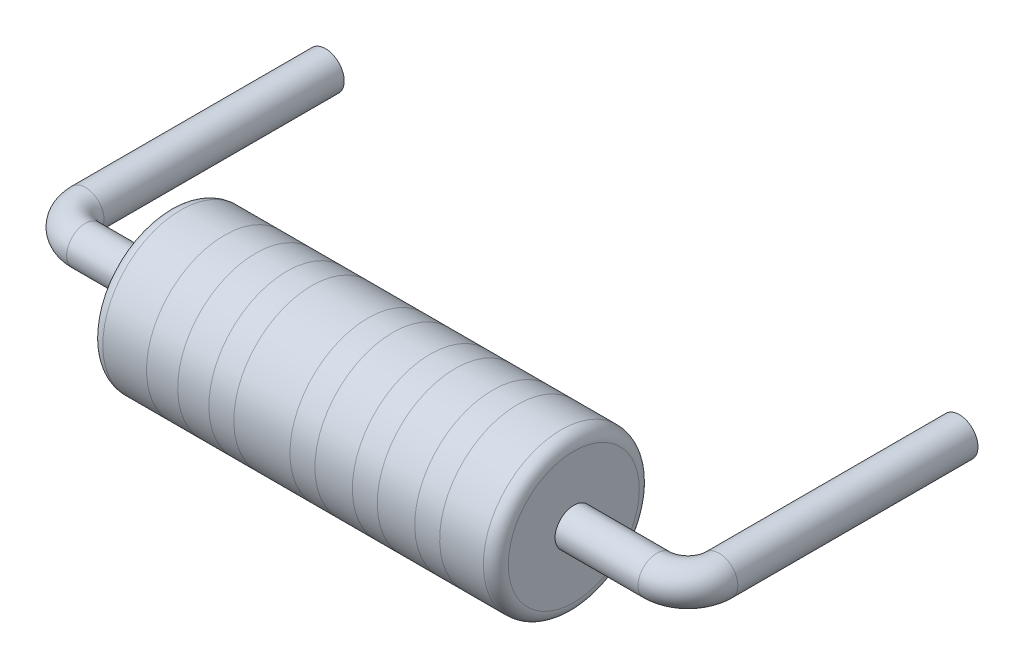
ISO-10303-21;
HEADER;
FILE_DESCRIPTION(('STEP AP214'),'2;1');
FILE_NAME('part.step','',(''),(''),'','','');
FILE_SCHEMA(('AUTOMOTIVE_DESIGN { 1 0 10303 214 1 1 1 1 }'));
ENDSEC;
DATA;
#1=APPLICATION_CONTEXT('core data for automotive mechanical design processes');
#2=APPLICATION_PROTOCOL_DEFINITION('international standard','automotive_design',2000,#1);
#3=PRODUCT_CONTEXT('',#1,'mechanical');
#4=PRODUCT('Part','Part','',(#3));
#5=PRODUCT_RELATED_PRODUCT_CATEGORY('part','',(#4));
#6=PRODUCT_DEFINITION_FORMATION('','',#4);
#7=PRODUCT_DEFINITION_CONTEXT('part definition',#1,'design');
#8=PRODUCT_DEFINITION('design','',#6,#7);
#9=PRODUCT_DEFINITION_SHAPE('','',#8);
#10=(LENGTH_UNIT() NAMED_UNIT(*) SI_UNIT(.MILLI.,.METRE.));
#11=(NAMED_UNIT(*) PLANE_ANGLE_UNIT() SI_UNIT($,.RADIAN.));
#12=(NAMED_UNIT(*) SI_UNIT($,.STERADIAN.) SOLID_ANGLE_UNIT());
#13=UNCERTAINTY_MEASURE_WITH_UNIT(LENGTH_MEASURE(1.E-05),#10,'distance_accuracy_value','');
#14=(GEOMETRIC_REPRESENTATION_CONTEXT(3) GLOBAL_UNCERTAINTY_ASSIGNED_CONTEXT((#13)) GLOBAL_UNIT_ASSIGNED_CONTEXT((#10,
#11,#12)) REPRESENTATION_CONTEXT('',''));
#15=CARTESIAN_POINT('',(0.,0.,0.));
#16=DIRECTION('',(0.,0.,1.));
#17=DIRECTION('',(1.,0.,0.));
#18=AXIS2_PLACEMENT_3D('',#15,#16,#17);
#19=CARTESIAN_POINT('',(1.35,-1.386,2.636));
#20=DIRECTION('',(1.,0.,0.));
#21=DIRECTION('',(0.,0.,-1.));
#22=AXIS2_PLACEMENT_3D('',#19,#20,#21);
#23=PLANE('',#22);
#24=CARTESIAN_POINT('',(1.35,0.,1.25));
#25=DIRECTION('',(1.,0.,0.));
#26=DIRECTION('',(0.,1.,0.));
#27=AXIS2_PLACEMENT_3D('',#24,#25,#26);
#28=CIRCLE('',#27,1.25);
#29=CARTESIAN_POINT('',(1.35,1.25,1.25));
#30=VERTEX_POINT('',#29);
#31=EDGE_CURVE('P0_E25',#30,#30,#28,.T.);
#32=ORIENTED_EDGE('',*,*,#31,.F.);
#33=EDGE_LOOP('',(#32));
#34=FACE_BOUND('',#33,.T.);
#35=ADVANCED_FACE('P0_F22',(#34),#23,.F.);
#36=CARTESIAN_POINT('',(0.,0.,1.25));
#37=DIRECTION('',(1.,0.,0.));
#38=DIRECTION('',(0.,1.,0.));
#39=AXIS2_PLACEMENT_3D('',#36,#37,#38);
#40=CYLINDRICAL_SURFACE('',#39,1.25);
#41=CARTESIAN_POINT('',(1.95,0.,1.25));
#42=DIRECTION('',(1.,0.,0.));
#43=DIRECTION('',(0.,1.,0.));
#44=AXIS2_PLACEMENT_3D('',#41,#42,#43);
#45=CIRCLE('',#44,1.25);
#46=CARTESIAN_POINT('',(1.95,1.25,1.25));
#47=VERTEX_POINT('',#46);
#48=EDGE_CURVE('P0_E12',#47,#47,#45,.T.);
#49=ORIENTED_EDGE('',*,*,#48,.F.);
#50=EDGE_LOOP('',(#49));
#51=FACE_BOUND('',#50,.T.);
#52=ORIENTED_EDGE('',*,*,#31,.T.);
#53=EDGE_LOOP('',(#52));
#54=FACE_BOUND('',#53,.T.);
#55=ADVANCED_FACE('P0_F34',(#51,#54),#40,.T.);
#56=CARTESIAN_POINT('',(1.95,-1.386,2.636));
#57=DIRECTION('',(1.,0.,0.));
#58=DIRECTION('',(0.,0.,-1.));
#59=AXIS2_PLACEMENT_3D('',#56,#57,#58);
#60=PLANE('',#59);
#61=ORIENTED_EDGE('',*,*,#48,.T.);
#62=EDGE_LOOP('',(#61));
#63=FACE_BOUND('',#62,.T.);
#64=ADVANCED_FACE('P0_F41',(#63),#60,.T.);
#65=CLOSED_SHELL('',(#35,#55,#64));
#66=MANIFOLD_SOLID_BREP('P0_B1',#65);
#67=CARTESIAN_POINT('',(3.25,0.,1.25));
#68=DIRECTION('',(1.,0.,0.));
#69=DIRECTION('',(0.,0.,-1.));
#70=AXIS2_PLACEMENT_3D('',#67,#68,#69);
#71=PLANE('',#70);
#72=CARTESIAN_POINT('',(3.25,0.,1.25));
#73=DIRECTION('',(-1.,0.,0.));
#74=DIRECTION('',(0.,0.,1.));
#75=AXIS2_PLACEMENT_3D('',#72,#73,#74);
#76=CIRCLE('',#75,1.05);
#77=CARTESIAN_POINT('',(3.25,0.,2.3));
#78=VERTEX_POINT('',#77);
#79=CARTESIAN_POINT('',(3.25,1.05,1.25));
#80=VERTEX_POINT('',#79);
#81=EDGE_CURVE('P1_E49',#78,#80,#76,.T.);
#82=ORIENTED_EDGE('',*,*,#81,.F.);
#83=CARTESIAN_POINT('',(3.25,0.,1.25));
#84=DIRECTION('',(-1.,0.,0.));
#85=DIRECTION('',(0.,0.,-1.));
#86=AXIS2_PLACEMENT_3D('',#83,#84,#85);
#87=CIRCLE('',#86,1.05);
#88=CARTESIAN_POINT('',(3.25,0.,0.2));
#89=VERTEX_POINT('',#88);
#90=EDGE_CURVE('P1_E42',#89,#78,#87,.T.);
#91=ORIENTED_EDGE('',*,*,#90,.F.);
#92=CARTESIAN_POINT('',(3.25,0.,1.25));
#93=DIRECTION('',(-1.,0.,0.));
#94=DIRECTION('',(0.,1.,0.));
#95=AXIS2_PLACEMENT_3D('',#92,#93,#94);
#96=CIRCLE('',#95,1.05);
#97=EDGE_CURVE('P1_E48',#80,#89,#96,.T.);
#98=ORIENTED_EDGE('',*,*,#97,.F.);
#99=EDGE_LOOP('',(#82,#91,#98));
#100=FACE_BOUND('',#99,.T.);
#101=ADVANCED_FACE('P1_F24',(#100),#71,.T.);
#102=CARTESIAN_POINT('',(3.05,0.,1.25));
#103=DIRECTION('',(1.,0.,0.));
#104=DIRECTION('',(0.,0.,-1.));
#105=AXIS2_PLACEMENT_3D('',#102,#103,#104);
#106=TOROIDAL_SURFACE('',#105,1.05,0.2);
#107=ORIENTED_EDGE('',*,*,#97,.T.);
#108=ORIENTED_EDGE('',*,*,#90,.T.);
#109=ORIENTED_EDGE('',*,*,#81,.T.);
#110=EDGE_LOOP('',(#107,#108,#109));
#111=FACE_BOUND('',#110,.T.);
#112=CARTESIAN_POINT('',(3.05,0.,1.25));
#113=DIRECTION('',(1.,0.,0.));
#114=DIRECTION('',(0.,1.,0.));
#115=AXIS2_PLACEMENT_3D('',#112,#113,#114);
#116=CIRCLE('',#115,1.25);
#117=CARTESIAN_POINT('',(3.05,1.25,1.25));
#118=VERTEX_POINT('',#117);
#119=EDGE_CURVE('P1_E34',#118,#118,#116,.F.);
#120=ORIENTED_EDGE('',*,*,#119,.F.);
#121=EDGE_LOOP('',(#120));
#122=FACE_BOUND('',#121,.T.);
#123=ADVANCED_FACE('P1_F51',(#111,#122),#106,.T.);
#124=CARTESIAN_POINT('',(0.,0.,1.25));
#125=DIRECTION('',(1.,0.,0.));
#126=DIRECTION('',(0.,1.,0.));
#127=AXIS2_PLACEMENT_3D('',#124,#125,#126);
#128=CYLINDRICAL_SURFACE('',#127,1.25);
#129=ORIENTED_EDGE('',*,*,#119,.T.);
#130=EDGE_LOOP('',(#129));
#131=FACE_BOUND('',#130,.T.);
#132=CARTESIAN_POINT('',(2.35,0.,1.25));
#133=DIRECTION('',(1.,0.,0.));
#134=DIRECTION('',(0.,1.,0.));
#135=AXIS2_PLACEMENT_3D('',#132,#133,#134);
#136=CIRCLE('',#135,1.25);
#137=CARTESIAN_POINT('',(2.35,1.25,1.25));
#138=VERTEX_POINT('',#137);
#139=EDGE_CURVE('P1_E13',#138,#138,#136,.T.);
#140=ORIENTED_EDGE('',*,*,#139,.T.);
#141=EDGE_LOOP('',(#140));
#142=FACE_BOUND('',#141,.T.);
#143=ADVANCED_FACE('P1_F96',(#131,#142),#128,.T.);
#144=CARTESIAN_POINT('',(2.35,-1.386,2.636));
#145=DIRECTION('',(1.,0.,0.));
#146=DIRECTION('',(0.,0.,-1.));
#147=AXIS2_PLACEMENT_3D('',#144,#145,#146);
#148=PLANE('',#147);
#149=ORIENTED_EDGE('',*,*,#139,.F.);
#150=EDGE_LOOP('',(#149));
#151=FACE_BOUND('',#150,.T.);
#152=ADVANCED_FACE('P1_F108',(#151),#148,.F.);
#153=CLOSED_SHELL('',(#101,#123,#143,#152));
#154=MANIFOLD_SOLID_BREP('P1_B1',#153);
#155=CARTESIAN_POINT('',(-0.05,0.,1.25));
#156=DIRECTION('',(-1.,0.,0.));
#157=DIRECTION('',(0.,0.,1.));
#158=AXIS2_PLACEMENT_3D('',#155,#156,#157);
#159=PLANE('',#158);
#160=CARTESIAN_POINT('',(-0.0499999999999997,0.,1.25));
#161=DIRECTION('',(1.,0.,0.));
#162=DIRECTION('',(0.,1.,0.));
#163=AXIS2_PLACEMENT_3D('',#160,#161,#162);
#164=CIRCLE('',#163,1.25);
#165=CARTESIAN_POINT('',(-0.0499999999999995,1.25,1.25));
#166=VERTEX_POINT('',#165);
#167=EDGE_CURVE('P2_E17',#166,#166,#164,.T.);
#168=ORIENTED_EDGE('',*,*,#167,.F.);
#169=EDGE_LOOP('',(#168));
#170=FACE_BOUND('',#169,.T.);
#171=ADVANCED_FACE('P2_F14',(#170),#159,.T.);
#172=CARTESIAN_POINT('',(0.1,0.,1.25));
#173=DIRECTION('',(1.,0.,0.));
#174=DIRECTION('',(0.,1.,0.));
#175=AXIS2_PLACEMENT_3D('',#172,#173,#174);
#176=CYLINDRICAL_SURFACE('',#175,1.25);
#177=CARTESIAN_POINT('',(0.35,0.,1.25));
#178=DIRECTION('',(1.,0.,0.));
#179=DIRECTION('',(0.,1.,0.));
#180=AXIS2_PLACEMENT_3D('',#177,#178,#179);
#181=CIRCLE('',#180,1.25);
#182=CARTESIAN_POINT('',(0.350000000000001,1.25,1.25));
#183=VERTEX_POINT('',#182);
#184=EDGE_CURVE('P2_E10',#183,#183,#181,.T.);
#185=ORIENTED_EDGE('',*,*,#184,.F.);
#186=EDGE_LOOP('',(#185));
#187=FACE_BOUND('',#186,.T.);
#188=ORIENTED_EDGE('',*,*,#167,.T.);
#189=EDGE_LOOP('',(#188));
#190=FACE_BOUND('',#189,.T.);
#191=ADVANCED_FACE('P2_F26',(#187,#190),#176,.T.);
#192=CARTESIAN_POINT('',(0.35,0.,1.25));
#193=DIRECTION('',(1.,0.,0.));
#194=DIRECTION('',(0.,0.,-1.));
#195=AXIS2_PLACEMENT_3D('',#192,#193,#194);
#196=PLANE('',#195);
#197=ORIENTED_EDGE('',*,*,#184,.T.);
#198=EDGE_LOOP('',(#197));
#199=FACE_BOUND('',#198,.T.);
#200=ADVANCED_FACE('P2_F33',(#199),#196,.T.);
#201=CLOSED_SHELL('',(#171,#191,#200));
#202=MANIFOLD_SOLID_BREP('P2_B1',#201);
#203=CARTESIAN_POINT('',(1.35,0.,1.25));
#204=DIRECTION('',(1.,0.,0.));
#205=DIRECTION('',(0.,0.,-1.));
#206=AXIS2_PLACEMENT_3D('',#203,#204,#205);
#207=PLANE('',#206);
#208=CARTESIAN_POINT('',(1.35,0.,1.25));
#209=DIRECTION('',(1.,0.,0.));
#210=DIRECTION('',(0.,1.,0.));
#211=AXIS2_PLACEMENT_3D('',#208,#209,#210);
#212=CIRCLE('',#211,1.25);
#213=CARTESIAN_POINT('',(1.35,1.25,1.25));
#214=VERTEX_POINT('',#213);
#215=EDGE_CURVE('P3_E17',#214,#214,#212,.F.);
#216=ORIENTED_EDGE('',*,*,#215,.F.);
#217=EDGE_LOOP('',(#216));
#218=FACE_BOUND('',#217,.T.);
#219=ADVANCED_FACE('P3_F14',(#218),#207,.T.);
#220=CARTESIAN_POINT('',(1.1,0.,1.25));
#221=DIRECTION('',(1.,0.,0.));
#222=DIRECTION('',(0.,1.,0.));
#223=AXIS2_PLACEMENT_3D('',#220,#221,#222);
#224=CYLINDRICAL_SURFACE('',#223,1.25);
#225=ORIENTED_EDGE('',*,*,#215,.T.);
#226=EDGE_LOOP('',(#225));
#227=FACE_BOUND('',#226,.T.);
#228=CARTESIAN_POINT('',(0.95,0.,1.25));
#229=DIRECTION('',(1.,0.,0.));
#230=DIRECTION('',(0.,1.,0.));
#231=AXIS2_PLACEMENT_3D('',#228,#229,#230);
#232=CIRCLE('',#231,1.25);
#233=CARTESIAN_POINT('',(0.95,1.25,1.25));
#234=VERTEX_POINT('',#233);
#235=EDGE_CURVE('P3_E10',#234,#234,#232,.F.);
#236=ORIENTED_EDGE('',*,*,#235,.F.);
#237=EDGE_LOOP('',(#236));
#238=FACE_BOUND('',#237,.T.);
#239=ADVANCED_FACE('P3_F26',(#227,#238),#224,.T.);
#240=CARTESIAN_POINT('',(0.95,0.,1.25));
#241=DIRECTION('',(-1.,0.,0.));
#242=DIRECTION('',(0.,0.,1.));
#243=AXIS2_PLACEMENT_3D('',#240,#241,#242);
#244=PLANE('',#243);
#245=ORIENTED_EDGE('',*,*,#235,.T.);
#246=EDGE_LOOP('',(#245));
#247=FACE_BOUND('',#246,.T.);
#248=ADVANCED_FACE('P3_F34',(#247),#244,.T.);
#249=CLOSED_SHELL('',(#219,#239,#248));
#250=MANIFOLD_SOLID_BREP('P3_B1',#249);
#251=CARTESIAN_POINT('',(-0.95,-1.386,2.636));
#252=DIRECTION('',(1.,0.,0.));
#253=DIRECTION('',(0.,0.,-1.));
#254=AXIS2_PLACEMENT_3D('',#251,#252,#253);
#255=PLANE('',#254);
#256=CARTESIAN_POINT('',(-0.95,0.,1.25));
#257=DIRECTION('',(1.,0.,0.));
#258=DIRECTION('',(0.,1.,0.));
#259=AXIS2_PLACEMENT_3D('',#256,#257,#258);
#260=CIRCLE('',#259,1.25);
#261=CARTESIAN_POINT('',(-0.949999999999999,1.25,1.25));
#262=VERTEX_POINT('',#261);
#263=EDGE_CURVE('P4_E25',#262,#262,#260,.T.);
#264=ORIENTED_EDGE('',*,*,#263,.F.);
#265=EDGE_LOOP('',(#264));
#266=FACE_BOUND('',#265,.T.);
#267=ADVANCED_FACE('P4_F22',(#266),#255,.F.);
#268=CARTESIAN_POINT('',(0.,0.,1.25));
#269=DIRECTION('',(1.,0.,0.));
#270=DIRECTION('',(0.,1.,0.));
#271=AXIS2_PLACEMENT_3D('',#268,#269,#270);
#272=CYLINDRICAL_SURFACE('',#271,1.25);
#273=CARTESIAN_POINT('',(-0.0499999999999997,0.,1.25));
#274=DIRECTION('',(1.,0.,0.));
#275=DIRECTION('',(0.,1.,0.));
#276=AXIS2_PLACEMENT_3D('',#273,#274,#275);
#277=CIRCLE('',#276,1.25);
#278=CARTESIAN_POINT('',(-0.0499999999999994,1.25,1.25));
#279=VERTEX_POINT('',#278);
#280=EDGE_CURVE('P4_E12',#279,#279,#277,.T.);
#281=ORIENTED_EDGE('',*,*,#280,.F.);
#282=EDGE_LOOP('',(#281));
#283=FACE_BOUND('',#282,.T.);
#284=ORIENTED_EDGE('',*,*,#263,.T.);
#285=EDGE_LOOP('',(#284));
#286=FACE_BOUND('',#285,.T.);
#287=ADVANCED_FACE('P4_F34',(#283,#286),#272,.T.);
#288=CARTESIAN_POINT('',(-0.05,-1.386,2.636));
#289=DIRECTION('',(1.,0.,0.));
#290=DIRECTION('',(0.,0.,-1.));
#291=AXIS2_PLACEMENT_3D('',#288,#289,#290);
#292=PLANE('',#291);
#293=ORIENTED_EDGE('',*,*,#280,.T.);
#294=EDGE_LOOP('',(#293));
#295=FACE_BOUND('',#294,.T.);
#296=ADVANCED_FACE('P4_F41',(#295),#292,.T.);
#297=CLOSED_SHELL('',(#267,#287,#296));
#298=MANIFOLD_SOLID_BREP('P4_B1',#297);
#299=CARTESIAN_POINT('',(-1.35,0.,1.25));
#300=DIRECTION('',(-1.,0.,0.));
#301=DIRECTION('',(0.,0.,1.));
#302=AXIS2_PLACEMENT_3D('',#299,#300,#301);
#303=PLANE('',#302);
#304=CARTESIAN_POINT('',(-1.35,0.,1.25));
#305=DIRECTION('',(1.,0.,0.));
#306=DIRECTION('',(0.,1.,0.));
#307=AXIS2_PLACEMENT_3D('',#304,#305,#306);
#308=CIRCLE('',#307,1.25);
#309=CARTESIAN_POINT('',(-1.35,1.25,1.25));
#310=VERTEX_POINT('',#309);
#311=EDGE_CURVE('P5_E25',#310,#310,#308,.T.);
#312=ORIENTED_EDGE('',*,*,#311,.F.);
#313=EDGE_LOOP('',(#312));
#314=FACE_BOUND('',#313,.T.);
#315=ADVANCED_FACE('P5_F22',(#314),#303,.T.);
#316=CARTESIAN_POINT('',(-1.2,0.,1.25));
#317=DIRECTION('',(1.,0.,0.));
#318=DIRECTION('',(0.,1.,0.));
#319=AXIS2_PLACEMENT_3D('',#316,#317,#318);
#320=CYLINDRICAL_SURFACE('',#319,1.25);
#321=CARTESIAN_POINT('',(-0.95,0.,1.25));
#322=DIRECTION('',(1.,0.,0.));
#323=DIRECTION('',(0.,1.,0.));
#324=AXIS2_PLACEMENT_3D('',#321,#322,#323);
#325=CIRCLE('',#324,1.25);
#326=CARTESIAN_POINT('',(-0.949999999999999,1.25,1.25));
#327=VERTEX_POINT('',#326);
#328=EDGE_CURVE('P5_E12',#327,#327,#325,.T.);
#329=ORIENTED_EDGE('',*,*,#328,.F.);
#330=EDGE_LOOP('',(#329));
#331=FACE_BOUND('',#330,.T.);
#332=ORIENTED_EDGE('',*,*,#311,.T.);
#333=EDGE_LOOP('',(#332));
#334=FACE_BOUND('',#333,.T.);
#335=ADVANCED_FACE('P5_F34',(#331,#334),#320,.T.);
#336=CARTESIAN_POINT('',(-0.95,0.,1.25));
#337=DIRECTION('',(1.,0.,0.));
#338=DIRECTION('',(0.,0.,-1.));
#339=AXIS2_PLACEMENT_3D('',#336,#337,#338);
#340=PLANE('',#339);
#341=ORIENTED_EDGE('',*,*,#328,.T.);
#342=EDGE_LOOP('',(#341));
#343=FACE_BOUND('',#342,.T.);
#344=ADVANCED_FACE('P5_F41',(#343),#340,.T.);
#345=CLOSED_SHELL('',(#315,#335,#344));
#346=MANIFOLD_SOLID_BREP('P5_B1',#345);
#347=CARTESIAN_POINT('',(-3.25,0.,1.25));
#348=DIRECTION('',(-1.,0.,0.));
#349=DIRECTION('',(0.,0.,1.));
#350=AXIS2_PLACEMENT_3D('',#347,#348,#349);
#351=PLANE('',#350);
#352=CARTESIAN_POINT('',(-3.25,0.,1.25));
#353=DIRECTION('',(1.,0.,0.));
#354=DIRECTION('',(0.,0.,-1.));
#355=AXIS2_PLACEMENT_3D('',#352,#353,#354);
#356=CIRCLE('',#355,1.05);
#357=CARTESIAN_POINT('',(-3.25,0.,0.2));
#358=VERTEX_POINT('',#357);
#359=CARTESIAN_POINT('',(-3.25,1.05,1.25));
#360=VERTEX_POINT('',#359);
#361=EDGE_CURVE('P6_E42',#358,#360,#356,.T.);
#362=ORIENTED_EDGE('',*,*,#361,.F.);
#363=CARTESIAN_POINT('',(-3.25,0.,1.25));
#364=DIRECTION('',(1.,0.,0.));
#365=DIRECTION('',(0.,0.,1.));
#366=AXIS2_PLACEMENT_3D('',#363,#364,#365);
#367=CIRCLE('',#366,1.05);
#368=CARTESIAN_POINT('',(-3.25,0.,2.3));
#369=VERTEX_POINT('',#368);
#370=EDGE_CURVE('P6_E51',#369,#358,#367,.T.);
#371=ORIENTED_EDGE('',*,*,#370,.F.);
#372=CARTESIAN_POINT('',(-3.25,0.,1.25));
#373=DIRECTION('',(1.,0.,0.));
#374=DIRECTION('',(0.,1.,0.));
#375=AXIS2_PLACEMENT_3D('',#372,#373,#374);
#376=CIRCLE('',#375,1.05);
#377=EDGE_CURVE('P6_E49',#360,#369,#376,.T.);
#378=ORIENTED_EDGE('',*,*,#377,.F.);
#379=EDGE_LOOP('',(#362,#371,#378));
#380=FACE_BOUND('',#379,.T.);
#381=ADVANCED_FACE('P6_F24',(#380),#351,.T.);
#382=CARTESIAN_POINT('',(-3.05,0.,1.25));
#383=DIRECTION('',(-1.,0.,0.));
#384=DIRECTION('',(0.,0.,1.));
#385=AXIS2_PLACEMENT_3D('',#382,#383,#384);
#386=TOROIDAL_SURFACE('',#385,1.05,0.2);
#387=ORIENTED_EDGE('',*,*,#377,.T.);
#388=ORIENTED_EDGE('',*,*,#370,.T.);
#389=ORIENTED_EDGE('',*,*,#361,.T.);
#390=EDGE_LOOP('',(#387,#388,#389));
#391=FACE_BOUND('',#390,.T.);
#392=CARTESIAN_POINT('',(-3.05,0.,1.25));
#393=DIRECTION('',(1.,0.,0.));
#394=DIRECTION('',(0.,1.,0.));
#395=AXIS2_PLACEMENT_3D('',#392,#393,#394);
#396=CIRCLE('',#395,1.25);
#397=CARTESIAN_POINT('',(-3.05,1.25,1.25));
#398=VERTEX_POINT('',#397);
#399=EDGE_CURVE('P6_E34',#398,#398,#396,.T.);
#400=ORIENTED_EDGE('',*,*,#399,.F.);
#401=EDGE_LOOP('',(#400));
#402=FACE_BOUND('',#401,.T.);
#403=ADVANCED_FACE('P6_F56',(#391,#402),#386,.T.);
#404=CARTESIAN_POINT('',(0.,0.,1.25));
#405=DIRECTION('',(1.,0.,0.));
#406=DIRECTION('',(0.,1.,0.));
#407=AXIS2_PLACEMENT_3D('',#404,#405,#406);
#408=CYLINDRICAL_SURFACE('',#407,1.25);
#409=ORIENTED_EDGE('',*,*,#399,.T.);
#410=EDGE_LOOP('',(#409));
#411=FACE_BOUND('',#410,.T.);
#412=CARTESIAN_POINT('',(-2.35,0.,1.25));
#413=DIRECTION('',(1.,0.,0.));
#414=DIRECTION('',(0.,1.,0.));
#415=AXIS2_PLACEMENT_3D('',#412,#413,#414);
#416=CIRCLE('',#415,1.25);
#417=CARTESIAN_POINT('',(-2.35,1.25,1.25));
#418=VERTEX_POINT('',#417);
#419=EDGE_CURVE('P6_E13',#418,#418,#416,.T.);
#420=ORIENTED_EDGE('',*,*,#419,.F.);
#421=EDGE_LOOP('',(#420));
#422=FACE_BOUND('',#421,.T.);
#423=ADVANCED_FACE('P6_F71',(#411,#422),#408,.T.);
#424=CARTESIAN_POINT('',(-2.35,-1.396,2.636));
#425=DIRECTION('',(1.,0.,0.));
#426=DIRECTION('',(0.,0.,-1.));
#427=AXIS2_PLACEMENT_3D('',#424,#425,#426);
#428=PLANE('',#427);
#429=ORIENTED_EDGE('',*,*,#419,.T.);
#430=EDGE_LOOP('',(#429));
#431=FACE_BOUND('',#430,.T.);
#432=ADVANCED_FACE('P6_F82',(#431),#428,.T.);
#433=CLOSED_SHELL('',(#381,#403,#423,#432));
#434=MANIFOLD_SOLID_BREP('P6_B1',#433);
#435=CARTESIAN_POINT('',(0.35,-1.386,2.636));
#436=DIRECTION('',(1.,0.,0.));
#437=DIRECTION('',(0.,0.,-1.));
#438=AXIS2_PLACEMENT_3D('',#435,#436,#437);
#439=PLANE('',#438);
#440=CARTESIAN_POINT('',(0.35,0.,1.25));
#441=DIRECTION('',(1.,0.,0.));
#442=DIRECTION('',(0.,1.,0.));
#443=AXIS2_PLACEMENT_3D('',#440,#441,#442);
#444=CIRCLE('',#443,1.25);
#445=CARTESIAN_POINT('',(0.350000000000001,1.25,1.25));
#446=VERTEX_POINT('',#445);
#447=EDGE_CURVE('P7_E25',#446,#446,#444,.T.);
#448=ORIENTED_EDGE('',*,*,#447,.F.);
#449=EDGE_LOOP('',(#448));
#450=FACE_BOUND('',#449,.T.);
#451=ADVANCED_FACE('P7_F22',(#450),#439,.F.);
#452=CARTESIAN_POINT('',(0.,0.,1.25));
#453=DIRECTION('',(1.,0.,0.));
#454=DIRECTION('',(0.,1.,0.));
#455=AXIS2_PLACEMENT_3D('',#452,#453,#454);
#456=CYLINDRICAL_SURFACE('',#455,1.25);
#457=CARTESIAN_POINT('',(0.95,0.,1.25));
#458=DIRECTION('',(1.,0.,0.));
#459=DIRECTION('',(0.,1.,0.));
#460=AXIS2_PLACEMENT_3D('',#457,#458,#459);
#461=CIRCLE('',#460,1.25);
#462=CARTESIAN_POINT('',(0.950000000000001,1.25,1.25));
#463=VERTEX_POINT('',#462);
#464=EDGE_CURVE('P7_E12',#463,#463,#461,.T.);
#465=ORIENTED_EDGE('',*,*,#464,.F.);
#466=EDGE_LOOP('',(#465));
#467=FACE_BOUND('',#466,.T.);
#468=ORIENTED_EDGE('',*,*,#447,.T.);
#469=EDGE_LOOP('',(#468));
#470=FACE_BOUND('',#469,.T.);
#471=ADVANCED_FACE('P7_F34',(#467,#470),#456,.T.);
#472=CARTESIAN_POINT('',(0.95,-1.386,2.636));
#473=DIRECTION('',(1.,0.,0.));
#474=DIRECTION('',(0.,0.,-1.));
#475=AXIS2_PLACEMENT_3D('',#472,#473,#474);
#476=PLANE('',#475);
#477=ORIENTED_EDGE('',*,*,#464,.T.);
#478=EDGE_LOOP('',(#477));
#479=FACE_BOUND('',#478,.T.);
#480=ADVANCED_FACE('P7_F41',(#479),#476,.T.);
#481=CLOSED_SHELL('',(#451,#471,#480));
#482=MANIFOLD_SOLID_BREP('P7_B1',#481);
#483=CARTESIAN_POINT('',(2.35,0.,1.25));
#484=DIRECTION('',(1.,0.,0.));
#485=DIRECTION('',(0.,0.,-1.));
#486=AXIS2_PLACEMENT_3D('',#483,#484,#485);
#487=PLANE('',#486);
#488=CARTESIAN_POINT('',(2.35,0.,1.25));
#489=DIRECTION('',(1.,0.,0.));
#490=DIRECTION('',(0.,1.,0.));
#491=AXIS2_PLACEMENT_3D('',#488,#489,#490);
#492=CIRCLE('',#491,1.25);
#493=CARTESIAN_POINT('',(2.35,1.25,1.25));
#494=VERTEX_POINT('',#493);
#495=EDGE_CURVE('P8_E25',#494,#494,#492,.F.);
#496=ORIENTED_EDGE('',*,*,#495,.F.);
#497=EDGE_LOOP('',(#496));
#498=FACE_BOUND('',#497,.T.);
#499=ADVANCED_FACE('P8_F22',(#498),#487,.T.);
#500=CARTESIAN_POINT('',(2.1,0.,1.25));
#501=DIRECTION('',(1.,0.,0.));
#502=DIRECTION('',(0.,1.,0.));
#503=AXIS2_PLACEMENT_3D('',#500,#501,#502);
#504=CYLINDRICAL_SURFACE('',#503,1.25);
#505=ORIENTED_EDGE('',*,*,#495,.T.);
#506=EDGE_LOOP('',(#505));
#507=FACE_BOUND('',#506,.T.);
#508=CARTESIAN_POINT('',(1.95,0.,1.25));
#509=DIRECTION('',(1.,0.,0.));
#510=DIRECTION('',(0.,1.,0.));
#511=AXIS2_PLACEMENT_3D('',#508,#509,#510);
#512=CIRCLE('',#511,1.25);
#513=CARTESIAN_POINT('',(1.95,1.25,1.25));
#514=VERTEX_POINT('',#513);
#515=EDGE_CURVE('P8_E12',#514,#514,#512,.F.);
#516=ORIENTED_EDGE('',*,*,#515,.F.);
#517=EDGE_LOOP('',(#516));
#518=FACE_BOUND('',#517,.T.);
#519=ADVANCED_FACE('P8_F34',(#507,#518),#504,.T.);
#520=CARTESIAN_POINT('',(1.95,0.,1.25));
#521=DIRECTION('',(-1.,0.,0.));
#522=DIRECTION('',(0.,0.,1.));
#523=AXIS2_PLACEMENT_3D('',#520,#521,#522);
#524=PLANE('',#523);
#525=ORIENTED_EDGE('',*,*,#515,.T.);
#526=EDGE_LOOP('',(#525));
#527=FACE_BOUND('',#526,.T.);
#528=ADVANCED_FACE('P8_F42',(#527),#524,.T.);
#529=CLOSED_SHELL('',(#499,#519,#528));
#530=MANIFOLD_SOLID_BREP('P8_B1',#529);
#531=CARTESIAN_POINT('',(-1.85,-1.396,2.636));
#532=DIRECTION('',(1.,0.,0.));
#533=DIRECTION('',(0.,0.,-1.));
#534=AXIS2_PLACEMENT_3D('',#531,#532,#533);
#535=PLANE('',#534);
#536=CARTESIAN_POINT('',(-1.85,0.,1.25));
#537=DIRECTION('',(1.,0.,0.));
#538=DIRECTION('',(0.,1.,0.));
#539=AXIS2_PLACEMENT_3D('',#536,#537,#538);
#540=CIRCLE('',#539,1.25);
#541=CARTESIAN_POINT('',(-1.85,1.25,1.25));
#542=VERTEX_POINT('',#541);
#543=EDGE_CURVE('P9_E17',#542,#542,#540,.T.);
#544=ORIENTED_EDGE('',*,*,#543,.F.);
#545=EDGE_LOOP('',(#544));
#546=FACE_BOUND('',#545,.T.);
#547=ADVANCED_FACE('P9_F14',(#546),#535,.F.);
#548=CARTESIAN_POINT('',(0.,0.,1.25));
#549=DIRECTION('',(1.,0.,0.));
#550=DIRECTION('',(0.,1.,0.));
#551=AXIS2_PLACEMENT_3D('',#548,#549,#550);
#552=CYLINDRICAL_SURFACE('',#551,1.25);
#553=CARTESIAN_POINT('',(-1.35,0.,1.25));
#554=DIRECTION('',(1.,0.,0.));
#555=DIRECTION('',(0.,1.,0.));
#556=AXIS2_PLACEMENT_3D('',#553,#554,#555);
#557=CIRCLE('',#556,1.25);
#558=CARTESIAN_POINT('',(-1.35,1.25,1.25));
#559=VERTEX_POINT('',#558);
#560=EDGE_CURVE('P9_E10',#559,#559,#557,.T.);
#561=ORIENTED_EDGE('',*,*,#560,.F.);
#562=EDGE_LOOP('',(#561));
#563=FACE_BOUND('',#562,.T.);
#564=ORIENTED_EDGE('',*,*,#543,.T.);
#565=EDGE_LOOP('',(#564));
#566=FACE_BOUND('',#565,.T.);
#567=ADVANCED_FACE('P9_F26',(#563,#566),#552,.T.);
#568=CARTESIAN_POINT('',(-1.35,-1.386,2.636));
#569=DIRECTION('',(1.,0.,0.));
#570=DIRECTION('',(0.,0.,-1.));
#571=AXIS2_PLACEMENT_3D('',#568,#569,#570);
#572=PLANE('',#571);
#573=ORIENTED_EDGE('',*,*,#560,.T.);
#574=EDGE_LOOP('',(#573));
#575=FACE_BOUND('',#574,.T.);
#576=ADVANCED_FACE('P9_F33',(#575),#572,.T.);
#577=CLOSED_SHELL('',(#547,#567,#576));
#578=MANIFOLD_SOLID_BREP('P9_B1',#577);
#579=CARTESIAN_POINT('',(-1.85,0.,1.25));
#580=DIRECTION('',(1.,0.,0.));
#581=DIRECTION('',(0.,0.,-1.));
#582=AXIS2_PLACEMENT_3D('',#579,#580,#581);
#583=PLANE('',#582);
#584=CARTESIAN_POINT('',(-1.85,0.,1.25));
#585=DIRECTION('',(1.,0.,0.));
#586=DIRECTION('',(0.,1.,0.));
#587=AXIS2_PLACEMENT_3D('',#584,#585,#586);
#588=CIRCLE('',#587,1.25);
#589=CARTESIAN_POINT('',(-1.85,1.25,1.25));
#590=VERTEX_POINT('',#589);
#591=EDGE_CURVE('P10_E17',#590,#590,#588,.F.);
#592=ORIENTED_EDGE('',*,*,#591,.F.);
#593=EDGE_LOOP('',(#592));
#594=FACE_BOUND('',#593,.T.);
#595=ADVANCED_FACE('P10_F14',(#594),#583,.T.);
#596=CARTESIAN_POINT('',(-2.1,0.,1.25));
#597=DIRECTION('',(1.,0.,0.));
#598=DIRECTION('',(0.,1.,0.));
#599=AXIS2_PLACEMENT_3D('',#596,#597,#598);
#600=CYLINDRICAL_SURFACE('',#599,1.25);
#601=CARTESIAN_POINT('',(-2.35,0.,1.25));
#602=DIRECTION('',(1.,0.,0.));
#603=DIRECTION('',(0.,1.,0.));
#604=AXIS2_PLACEMENT_3D('',#601,#602,#603);
#605=CIRCLE('',#604,1.25);
#606=CARTESIAN_POINT('',(-2.35,1.25,1.25));
#607=VERTEX_POINT('',#606);
#608=EDGE_CURVE('P10_E10',#607,#607,#605,.F.);
#609=ORIENTED_EDGE('',*,*,#608,.F.);
#610=EDGE_LOOP('',(#609));
#611=FACE_BOUND('',#610,.T.);
#612=ORIENTED_EDGE('',*,*,#591,.T.);
#613=EDGE_LOOP('',(#612));
#614=FACE_BOUND('',#613,.T.);
#615=ADVANCED_FACE('P10_F26',(#611,#614),#600,.T.);
#616=CARTESIAN_POINT('',(-2.35,0.,1.25));
#617=DIRECTION('',(-1.,0.,0.));
#618=DIRECTION('',(0.,0.,1.));
#619=AXIS2_PLACEMENT_3D('',#616,#617,#618);
#620=PLANE('',#619);
#621=ORIENTED_EDGE('',*,*,#608,.T.);
#622=EDGE_LOOP('',(#621));
#623=FACE_BOUND('',#622,.T.);
#624=ADVANCED_FACE('P10_F33',(#623),#620,.T.);
#625=CLOSED_SHELL('',(#595,#615,#624));
#626=MANIFOLD_SOLID_BREP('P10_B1',#625);
#627=CARTESIAN_POINT('',(3.25,0.306,0.95));
#628=DIRECTION('',(1.,0.,0.));
#629=DIRECTION('',(0.,0.,1.));
#630=AXIS2_PLACEMENT_3D('',#627,#628,#629);
#631=PLANE('',#630);
#632=CARTESIAN_POINT('',(3.25,0.,1.25));
#633=DIRECTION('',(-1.,0.,0.));
#634=DIRECTION('',(0.,0.,1.));
#635=AXIS2_PLACEMENT_3D('',#632,#633,#634);
#636=CIRCLE('',#635,0.300000000000011);
#637=CARTESIAN_POINT('',(3.25,0.,1.55000000000001));
#638=VERTEX_POINT('',#637);
#639=EDGE_CURVE('P11_E26',#638,#638,#636,.F.);
#640=ORIENTED_EDGE('',*,*,#639,.F.);
#641=EDGE_LOOP('',(#640));
#642=FACE_BOUND('',#641,.T.);
#643=ADVANCED_FACE('P11_F22',(#642),#631,.F.);
#644=CARTESIAN_POINT('',(4.58,0.,1.25));
#645=DIRECTION('',(-1.,0.,0.));
#646=DIRECTION('',(0.,0.,1.));
#647=AXIS2_PLACEMENT_3D('',#644,#645,#646);
#648=CYLINDRICAL_SURFACE('',#647,0.300000000000011);
#649=ORIENTED_EDGE('',*,*,#639,.T.);
#650=EDGE_LOOP('',(#649));
#651=FACE_BOUND('',#650,.T.);
#652=CARTESIAN_POINT('',(4.58,0.,1.25));
#653=DIRECTION('',(1.,0.,0.));
#654=DIRECTION('',(0.,0.,-1.));
#655=AXIS2_PLACEMENT_3D('',#652,#653,#654);
#656=CIRCLE('',#655,0.300000000000011);
#657=CARTESIAN_POINT('',(4.58,0.,1.55000000000001));
#658=VERTEX_POINT('',#657);
#659=EDGE_CURVE('P11_E34',#658,#658,#656,.T.);
#660=ORIENTED_EDGE('',*,*,#659,.F.);
#661=EDGE_LOOP('',(#660));
#662=FACE_BOUND('',#661,.T.);
#663=ADVANCED_FACE('P11_F43',(#651,#662),#648,.T.);
#664=CARTESIAN_POINT('',(4.58,0.,0.75));
#665=DIRECTION('',(0.,-1.,0.));
#666=DIRECTION('',(0.,0.,-1.));
#667=AXIS2_PLACEMENT_3D('',#664,#665,#666);
#668=TOROIDAL_SURFACE('',#667,0.5,0.300000000000011);
#669=CARTESIAN_POINT('',(5.08,0.,0.75));
#670=DIRECTION('',(0.,0.,-1.));
#671=DIRECTION('',(0.,1.,0.));
#672=AXIS2_PLACEMENT_3D('',#669,#670,#671);
#673=CIRCLE('',#672,0.300000000000011);
#674=CARTESIAN_POINT('',(5.38000000000001,0.,0.75));
#675=VERTEX_POINT('',#674);
#676=EDGE_CURVE('P11_E30',#675,#675,#673,.T.);
#677=CARTESIAN_POINT('',(4.58,0.,0.75));
#678=DIRECTION('',(0.,-1.,0.));
#679=DIRECTION('',(0.,0.,-1.));
#680=AXIS2_PLACEMENT_3D('',#677,#678,#679);
#681=CIRCLE('',#680,0.800000000000011);
#682=EDGE_CURVE('',#675,#658,#681,.T.);
#683=ORIENTED_EDGE('',*,*,#676,.F.);
#684=ORIENTED_EDGE('',*,*,#659,.T.);
#685=ORIENTED_EDGE('',*,*,#682,.T.);
#686=ORIENTED_EDGE('',*,*,#682,.F.);
#687=EDGE_LOOP('',(#683,#685,#684,#686));
#688=FACE_BOUND('',#687,.T.);
#689=ADVANCED_FACE('P11_F52',(#688),#668,.T.);
#690=CARTESIAN_POINT('',(5.08,0.,-3.1));
#691=DIRECTION('',(0.,0.,1.));
#692=DIRECTION('',(1.,0.,0.));
#693=AXIS2_PLACEMENT_3D('',#690,#691,#692);
#694=PLANE('',#693);
#695=CARTESIAN_POINT('',(5.08,0.,-3.1));
#696=DIRECTION('',(0.,0.,1.));
#697=DIRECTION('',(1.,0.,0.));
#698=AXIS2_PLACEMENT_3D('',#695,#696,#697);
#699=CIRCLE('',#698,0.300000000000011);
#700=CARTESIAN_POINT('',(5.38000000000001,0.,-3.1));
#701=VERTEX_POINT('',#700);
#702=EDGE_CURVE('P11_E12',#701,#701,#699,.T.);
#703=ORIENTED_EDGE('',*,*,#702,.F.);
#704=EDGE_LOOP('',(#703));
#705=FACE_BOUND('',#704,.T.);
#706=ADVANCED_FACE('P11_F56',(#705),#694,.F.);
#707=CARTESIAN_POINT('',(5.08,0.,-3.1));
#708=DIRECTION('',(0.,0.,1.));
#709=DIRECTION('',(1.,0.,0.));
#710=AXIS2_PLACEMENT_3D('',#707,#708,#709);
#711=CYLINDRICAL_SURFACE('',#710,0.300000000000011);
#712=ORIENTED_EDGE('',*,*,#676,.T.);
#713=EDGE_LOOP('',(#712));
#714=FACE_BOUND('',#713,.T.);
#715=ORIENTED_EDGE('',*,*,#702,.T.);
#716=EDGE_LOOP('',(#715));
#717=FACE_BOUND('',#716,.T.);
#718=ADVANCED_FACE('P11_F24',(#714,#717),#711,.T.);
#719=CLOSED_SHELL('',(#643,#663,#689,#706,#718));
#720=MANIFOLD_SOLID_BREP('P11_B1',#719);
#721=CARTESIAN_POINT('',(-3.25,0.,1.25));
#722=DIRECTION('',(-1.,0.,0.));
#723=DIRECTION('',(0.,0.,1.));
#724=AXIS2_PLACEMENT_3D('',#721,#722,#723);
#725=PLANE('',#724);
#726=CARTESIAN_POINT('',(-3.25,0.,1.25));
#727=DIRECTION('',(1.,0.,0.));
#728=DIRECTION('',(0.,0.,-1.));
#729=AXIS2_PLACEMENT_3D('',#726,#727,#728);
#730=CIRCLE('',#729,0.3);
#731=CARTESIAN_POINT('',(-3.25,0.,0.95));
#732=VERTEX_POINT('',#731);
#733=EDGE_CURVE('P12_E25',#732,#732,#730,.F.);
#734=ORIENTED_EDGE('',*,*,#733,.F.);
#735=EDGE_LOOP('',(#734));
#736=FACE_BOUND('',#735,.T.);
#737=ADVANCED_FACE('P12_F22',(#736),#725,.F.);
#738=CARTESIAN_POINT('',(-4.58,0.,1.25));
#739=DIRECTION('',(1.,0.,0.));
#740=DIRECTION('',(0.,0.,-1.));
#741=AXIS2_PLACEMENT_3D('',#738,#739,#740);
#742=CYLINDRICAL_SURFACE('',#741,0.3);
#743=CARTESIAN_POINT('',(-4.58,0.,1.25));
#744=DIRECTION('',(1.,0.,0.));
#745=DIRECTION('',(0.,0.,1.));
#746=AXIS2_PLACEMENT_3D('',#743,#744,#745);
#747=CIRCLE('',#746,0.3);
#748=CARTESIAN_POINT('',(-4.58,0.,1.55));
#749=VERTEX_POINT('',#748);
#750=EDGE_CURVE('P12_E34',#749,#749,#747,.F.);
#751=ORIENTED_EDGE('',*,*,#750,.F.);
#752=EDGE_LOOP('',(#751));
#753=FACE_BOUND('',#752,.T.);
#754=ORIENTED_EDGE('',*,*,#733,.T.);
#755=EDGE_LOOP('',(#754));
#756=FACE_BOUND('',#755,.T.);
#757=ADVANCED_FACE('P12_F44',(#753,#756),#742,.T.);
#758=CARTESIAN_POINT('',(-5.08,0.,-3.1));
#759=DIRECTION('',(0.,0.,1.));
#760=DIRECTION('',(1.,0.,0.));
#761=AXIS2_PLACEMENT_3D('',#758,#759,#760);
#762=PLANE('',#761);
#763=CARTESIAN_POINT('',(-5.08,0.,-3.1));
#764=DIRECTION('',(0.,0.,1.));
#765=DIRECTION('',(1.,0.,0.));
#766=AXIS2_PLACEMENT_3D('',#763,#764,#765);
#767=CIRCLE('',#766,0.3);
#768=CARTESIAN_POINT('',(-4.78,0.,-3.1));
#769=VERTEX_POINT('',#768);
#770=EDGE_CURVE('P12_E29',#769,#769,#767,.T.);
#771=ORIENTED_EDGE('',*,*,#770,.F.);
#772=EDGE_LOOP('',(#771));
#773=FACE_BOUND('',#772,.T.);
#774=ADVANCED_FACE('P12_F51',(#773),#762,.F.);
#775=CARTESIAN_POINT('',(-4.58,0.,0.75));
#776=DIRECTION('',(0.,1.,0.));
#777=DIRECTION('',(0.,0.,1.));
#778=AXIS2_PLACEMENT_3D('',#775,#776,#777);
#779=TOROIDAL_SURFACE('',#778,0.5,0.3);
#780=CARTESIAN_POINT('',(-5.08,0.,0.75));
#781=DIRECTION('',(0.,0.,1.));
#782=DIRECTION('',(1.,0.,0.));
#783=AXIS2_PLACEMENT_3D('',#780,#781,#782);
#784=CIRCLE('',#783,0.3);
#785=CARTESIAN_POINT('',(-4.78,0.,0.75));
#786=VERTEX_POINT('',#785);
#787=EDGE_CURVE('P12_E12',#786,#786,#784,.F.);
#788=ORIENTED_EDGE('',*,*,#787,.F.);
#789=EDGE_LOOP('',(#788));
#790=FACE_BOUND('',#789,.T.);
#791=ORIENTED_EDGE('',*,*,#750,.T.);
#792=EDGE_LOOP('',(#791));
#793=FACE_BOUND('',#792,.T.);
#794=ADVANCED_FACE('P12_F55',(#790,#793),#779,.T.);
#795=CARTESIAN_POINT('',(-5.08,0.,-3.2));
#796=DIRECTION('',(0.,0.,1.));
#797=DIRECTION('',(1.,0.,0.));
#798=AXIS2_PLACEMENT_3D('',#795,#796,#797);
#799=CYLINDRICAL_SURFACE('',#798,0.3);
#800=ORIENTED_EDGE('',*,*,#770,.T.);
#801=EDGE_LOOP('',(#800));
#802=FACE_BOUND('',#801,.T.);
#803=ORIENTED_EDGE('',*,*,#787,.T.);
#804=EDGE_LOOP('',(#803));
#805=FACE_BOUND('',#804,.T.);
#806=ADVANCED_FACE('P12_F53',(#802,#805),#799,.T.);
#807=CLOSED_SHELL('',(#737,#757,#774,#794,#806));
#808=MANIFOLD_SOLID_BREP('P12_B1',#807);
#809=ADVANCED_BREP_SHAPE_REPRESENTATION('',(#18,#66,#154,#202,#250,#298,#346,#434,#482,#530,
#578,#626,#720,#808),#14);
#810=SHAPE_DEFINITION_REPRESENTATION(#9,#809);
ENDSEC;
END-ISO-10303-21;
